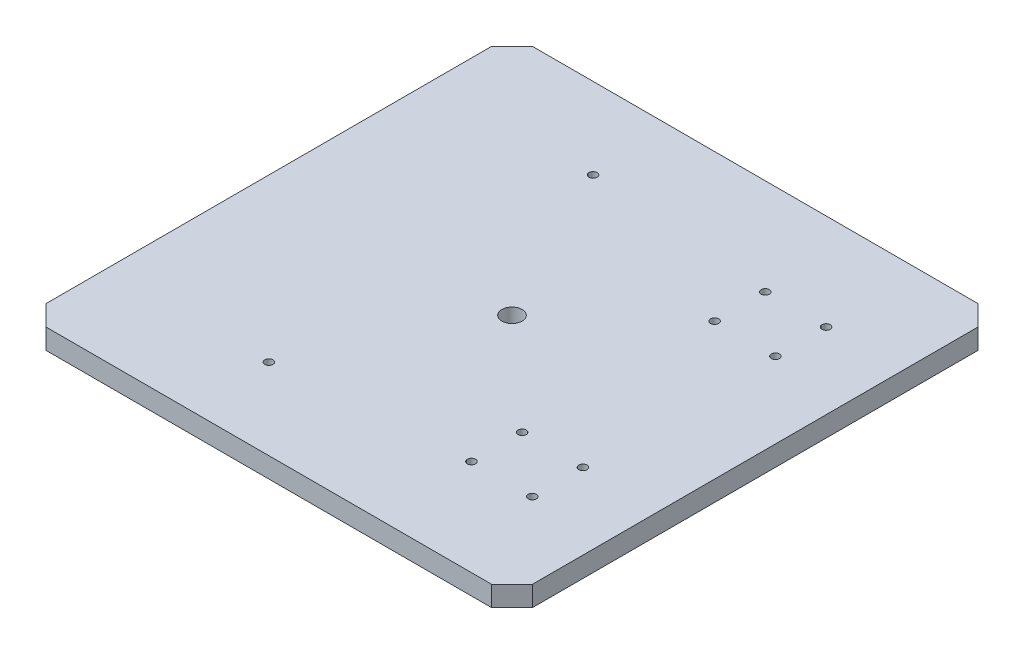
ISO-10303-21;
HEADER;
FILE_DESCRIPTION(('STEP AP214'),'2;1');
FILE_NAME('part.step','',(''),(''),'','','');
FILE_SCHEMA(('AUTOMOTIVE_DESIGN { 1 0 10303 214 1 1 1 1 }'));
ENDSEC;
DATA;
#1=APPLICATION_CONTEXT('core data for automotive mechanical design processes');
#2=APPLICATION_PROTOCOL_DEFINITION('international standard','automotive_design',2000,#1);
#3=PRODUCT_CONTEXT('',#1,'mechanical');
#4=PRODUCT('Part','Part','',(#3));
#5=PRODUCT_RELATED_PRODUCT_CATEGORY('part','',(#4));
#6=PRODUCT_DEFINITION_FORMATION('','',#4);
#7=PRODUCT_DEFINITION_CONTEXT('part definition',#1,'design');
#8=PRODUCT_DEFINITION('design','',#6,#7);
#9=PRODUCT_DEFINITION_SHAPE('','',#8);
#10=(LENGTH_UNIT() NAMED_UNIT(*) SI_UNIT(.MILLI.,.METRE.));
#11=(NAMED_UNIT(*) PLANE_ANGLE_UNIT() SI_UNIT($,.RADIAN.));
#12=(NAMED_UNIT(*) SI_UNIT($,.STERADIAN.) SOLID_ANGLE_UNIT());
#13=UNCERTAINTY_MEASURE_WITH_UNIT(LENGTH_MEASURE(1.E-05),#10,'distance_accuracy_value','');
#14=(GEOMETRIC_REPRESENTATION_CONTEXT(3) GLOBAL_UNCERTAINTY_ASSIGNED_CONTEXT((#13)) GLOBAL_UNIT_ASSIGNED_CONTEXT((#10,
#11,#12)) REPRESENTATION_CONTEXT('',''));
#15=CARTESIAN_POINT('',(0.,0.,0.));
#16=DIRECTION('',(0.,0.,1.));
#17=DIRECTION('',(1.,0.,0.));
#18=AXIS2_PLACEMENT_3D('',#15,#16,#17);
#19=CARTESIAN_POINT('',(0.,0.,0.));
#20=DIRECTION('',(0.,-1.,0.));
#21=DIRECTION('',(0.,0.,-1.));
#22=AXIS2_PLACEMENT_3D('',#19,#20,#21);
#23=PLANE('',#22);
#24=CARTESIAN_POINT('',(257.175,0.,-244.475));
#25=DIRECTION('',(0.,1.,0.));
#26=DIRECTION('',(0.,0.,1.));
#27=AXIS2_PLACEMENT_3D('',#24,#25,#26);
#28=CIRCLE('',#27,2.55270000000002);
#29=CARTESIAN_POINT('',(257.175,0.,-241.9223));
#30=VERTEX_POINT('',#29);
#31=EDGE_CURVE('E237',#30,#30,#28,.T.);
#32=ORIENTED_EDGE('',*,*,#31,.T.);
#33=EDGE_LOOP('',(#32));
#34=FACE_BOUND('',#33,.T.);
#35=CARTESIAN_POINT('',(219.075,0.,-244.475));
#36=DIRECTION('',(0.,1.,0.));
#37=DIRECTION('',(0.,0.,1.));
#38=AXIS2_PLACEMENT_3D('',#35,#36,#37);
#39=CIRCLE('',#38,2.55269999999999);
#40=CARTESIAN_POINT('',(219.075,0.,-241.9223));
#41=VERTEX_POINT('',#40);
#42=EDGE_CURVE('E231',#41,#41,#39,.T.);
#43=ORIENTED_EDGE('',*,*,#42,.T.);
#44=EDGE_LOOP('',(#43));
#45=FACE_BOUND('',#44,.T.);
#46=CARTESIAN_POINT('',(257.175,0.,-212.725));
#47=DIRECTION('',(0.,1.,0.));
#48=DIRECTION('',(0.,0.,1.));
#49=AXIS2_PLACEMENT_3D('',#46,#47,#48);
#50=CIRCLE('',#49,2.55270000000002);
#51=CARTESIAN_POINT('',(257.175,0.,-210.1723));
#52=VERTEX_POINT('',#51);
#53=EDGE_CURVE('E225',#52,#52,#50,.T.);
#54=ORIENTED_EDGE('',*,*,#53,.T.);
#55=EDGE_LOOP('',(#54));
#56=FACE_BOUND('',#55,.T.);
#57=CARTESIAN_POINT('',(219.075,0.,-212.725));
#58=DIRECTION('',(0.,1.,0.));
#59=DIRECTION('',(0.,0.,1.));
#60=AXIS2_PLACEMENT_3D('',#57,#58,#59);
#61=CIRCLE('',#60,2.55269999999999);
#62=CARTESIAN_POINT('',(219.075,0.,-210.1723));
#63=VERTEX_POINT('',#62);
#64=EDGE_CURVE('E219',#63,#63,#61,.T.);
#65=ORIENTED_EDGE('',*,*,#64,.T.);
#66=EDGE_LOOP('',(#65));
#67=FACE_BOUND('',#66,.T.);
#68=CARTESIAN_POINT('',(257.175,0.,-92.0749999999999));
#69=DIRECTION('',(0.,1.,0.));
#70=DIRECTION('',(0.,0.,1.));
#71=AXIS2_PLACEMENT_3D('',#68,#69,#70);
#72=CIRCLE('',#71,2.55270000000002);
#73=CARTESIAN_POINT('',(257.175,0.,-89.5222999999999));
#74=VERTEX_POINT('',#73);
#75=EDGE_CURVE('E213',#74,#74,#72,.T.);
#76=ORIENTED_EDGE('',*,*,#75,.T.);
#77=EDGE_LOOP('',(#76));
#78=FACE_BOUND('',#77,.T.);
#79=DIRECTION('',(1.,0.,0.));
#80=VECTOR('',#79,1.);
#81=CARTESIAN_POINT('',(0.,0.,0.));
#82=LINE('',#81,#80);
#83=CARTESIAN_POINT('',(12.7,0.,0.));
#84=VERTEX_POINT('',#83);
#85=CARTESIAN_POINT('',(292.1,0.,0.));
#86=VERTEX_POINT('',#85);
#87=EDGE_CURVE('E118',#84,#86,#82,.T.);
#88=ORIENTED_EDGE('',*,*,#87,.F.);
#89=DIRECTION('',(0.707106781186546,0.,0.707106781186549));
#90=VECTOR('',#89,1.);
#91=CARTESIAN_POINT('',(6.35000000000002,0.,-6.34999999999999));
#92=LINE('',#91,#90);
#93=CARTESIAN_POINT('',(0.,0.,-12.7));
#94=VERTEX_POINT('',#93);
#95=EDGE_CURVE('E101',#84,#94,#92,.F.);
#96=ORIENTED_EDGE('',*,*,#95,.T.);
#97=DIRECTION('',(0.,0.,1.));
#98=VECTOR('',#97,1.);
#99=CARTESIAN_POINT('',(0.,0.,0.));
#100=LINE('',#99,#98);
#101=CARTESIAN_POINT('',(0.,0.,-292.1));
#102=VERTEX_POINT('',#101);
#103=EDGE_CURVE('E128',#102,#94,#100,.T.);
#104=ORIENTED_EDGE('',*,*,#103,.F.);
#105=DIRECTION('',(-0.707106781186549,0.,0.707106781186546));
#106=VECTOR('',#105,1.);
#107=CARTESIAN_POINT('',(-146.05,0.,-146.050000000001));
#108=LINE('',#107,#106);
#109=CARTESIAN_POINT('',(12.7,0.,-304.8));
#110=VERTEX_POINT('',#109);
#111=EDGE_CURVE('E112',#102,#110,#108,.F.);
#112=ORIENTED_EDGE('',*,*,#111,.T.);
#113=DIRECTION('',(-1.,0.,0.));
#114=VECTOR('',#113,1.);
#115=CARTESIAN_POINT('',(0.,0.,-304.8));
#116=LINE('',#115,#114);
#117=CARTESIAN_POINT('',(292.1,0.,-304.8));
#118=VERTEX_POINT('',#117);
#119=EDGE_CURVE('E131',#118,#110,#116,.T.);
#120=ORIENTED_EDGE('',*,*,#119,.F.);
#121=DIRECTION('',(-0.707106781186546,0.,-0.707106781186549));
#122=VECTOR('',#121,1.);
#123=CARTESIAN_POINT('',(298.450000000001,0.,-298.449999999999));
#124=LINE('',#123,#122);
#125=CARTESIAN_POINT('',(304.8,0.,-292.1));
#126=VERTEX_POINT('',#125);
#127=EDGE_CURVE('E142',#118,#126,#124,.F.);
#128=ORIENTED_EDGE('',*,*,#127,.T.);
#129=DIRECTION('',(0.,0.,-1.));
#130=VECTOR('',#129,1.);
#131=CARTESIAN_POINT('',(304.8,0.,0.));
#132=LINE('',#131,#130);
#133=CARTESIAN_POINT('',(304.8,0.,-12.7));
#134=VERTEX_POINT('',#133);
#135=EDGE_CURVE('E127',#134,#126,#132,.T.);
#136=ORIENTED_EDGE('',*,*,#135,.F.);
#137=DIRECTION('',(0.707106781186549,0.,-0.707106781186546));
#138=VECTOR('',#137,1.);
#139=CARTESIAN_POINT('',(146.049999999999,0.,146.05));
#140=LINE('',#139,#138);
#141=EDGE_CURVE('E122',#134,#86,#140,.F.);
#142=ORIENTED_EDGE('',*,*,#141,.T.);
#143=EDGE_LOOP('',(#88,#96,#104,#112,#120,#128,#136,#142));
#144=FACE_BOUND('',#143,.T.);
#145=CARTESIAN_POINT('',(101.6,0.,-254.));
#146=DIRECTION('',(0.,1.,0.));
#147=DIRECTION('',(0.,0.,1.));
#148=AXIS2_PLACEMENT_3D('',#145,#146,#147);
#149=CIRCLE('',#148,2.55269999999999);
#150=CARTESIAN_POINT('',(101.6,0.,-251.4473));
#151=VERTEX_POINT('',#150);
#152=EDGE_CURVE('E133',#151,#151,#149,.T.);
#153=ORIENTED_EDGE('',*,*,#152,.T.);
#154=EDGE_LOOP('',(#153));
#155=FACE_BOUND('',#154,.T.);
#156=CARTESIAN_POINT('',(101.6,0.,-50.7999999999999));
#157=DIRECTION('',(0.,1.,0.));
#158=DIRECTION('',(0.,0.,1.));
#159=AXIS2_PLACEMENT_3D('',#156,#157,#158);
#160=CIRCLE('',#159,2.55269999999999);
#161=CARTESIAN_POINT('',(101.6,0.,-48.2472999999999));
#162=VERTEX_POINT('',#161);
#163=EDGE_CURVE('E183',#162,#162,#160,.T.);
#164=ORIENTED_EDGE('',*,*,#163,.T.);
#165=EDGE_LOOP('',(#164));
#166=FACE_BOUND('',#165,.T.);
#167=CARTESIAN_POINT('',(152.4,0.,-152.4));
#168=DIRECTION('',(0.,1.,0.));
#169=DIRECTION('',(0.,0.,1.));
#170=AXIS2_PLACEMENT_3D('',#167,#168,#169);
#171=CIRCLE('',#170,6.34999999999999);
#172=CARTESIAN_POINT('',(152.4,0.,-146.05));
#173=VERTEX_POINT('',#172);
#174=EDGE_CURVE('E192',#173,#173,#171,.T.);
#175=ORIENTED_EDGE('',*,*,#174,.T.);
#176=EDGE_LOOP('',(#175));
#177=FACE_BOUND('',#176,.T.);
#178=CARTESIAN_POINT('',(219.075,0.,-60.3249999999999));
#179=DIRECTION('',(0.,1.,0.));
#180=DIRECTION('',(0.,0.,1.));
#181=AXIS2_PLACEMENT_3D('',#178,#179,#180);
#182=CIRCLE('',#181,2.55269999999999);
#183=CARTESIAN_POINT('',(219.075,0.,-57.7722999999999));
#184=VERTEX_POINT('',#183);
#185=EDGE_CURVE('E195',#184,#184,#182,.T.);
#186=ORIENTED_EDGE('',*,*,#185,.T.);
#187=EDGE_LOOP('',(#186));
#188=FACE_BOUND('',#187,.T.);
#189=CARTESIAN_POINT('',(257.175,0.,-60.3249999999999));
#190=DIRECTION('',(0.,1.,0.));
#191=DIRECTION('',(0.,0.,1.));
#192=AXIS2_PLACEMENT_3D('',#189,#190,#191);
#193=CIRCLE('',#192,2.55270000000002);
#194=CARTESIAN_POINT('',(257.175,0.,-57.7722999999999));
#195=VERTEX_POINT('',#194);
#196=EDGE_CURVE('E201',#195,#195,#193,.T.);
#197=ORIENTED_EDGE('',*,*,#196,.T.);
#198=EDGE_LOOP('',(#197));
#199=FACE_BOUND('',#198,.T.);
#200=CARTESIAN_POINT('',(219.075,0.,-92.075));
#201=DIRECTION('',(0.,1.,0.));
#202=DIRECTION('',(0.,0.,1.));
#203=AXIS2_PLACEMENT_3D('',#200,#201,#202);
#204=CIRCLE('',#203,2.55269999999999);
#205=CARTESIAN_POINT('',(219.075,0.,-89.5223));
#206=VERTEX_POINT('',#205);
#207=EDGE_CURVE('E207',#206,#206,#204,.T.);
#208=ORIENTED_EDGE('',*,*,#207,.T.);
#209=EDGE_LOOP('',(#208));
#210=FACE_BOUND('',#209,.T.);
#211=ADVANCED_FACE('F35',(#34,#45,#56,#67,#78,#144,#155,#166,#177,#188,#199,#210),#23,.T.);
#212=CARTESIAN_POINT('',(0.,12.7,0.));
#213=DIRECTION('',(1.,0.,0.));
#214=DIRECTION('',(0.,0.,-1.));
#215=AXIS2_PLACEMENT_3D('',#212,#213,#214);
#216=PLANE('',#215);
#217=ORIENTED_EDGE('',*,*,#103,.T.);
#218=DIRECTION('',(0.,1.,0.));
#219=VECTOR('',#218,1.);
#220=CARTESIAN_POINT('',(0.,12.7,-12.7));
#221=LINE('',#220,#219);
#222=CARTESIAN_POINT('',(0.,12.7,-12.7));
#223=VERTEX_POINT('',#222);
#224=EDGE_CURVE('E106',#94,#223,#221,.T.);
#225=ORIENTED_EDGE('',*,*,#224,.T.);
#226=DIRECTION('',(0.,0.,1.));
#227=VECTOR('',#226,1.);
#228=CARTESIAN_POINT('',(0.,12.7,0.));
#229=LINE('',#228,#227);
#230=CARTESIAN_POINT('',(0.,12.7,-292.1));
#231=VERTEX_POINT('',#230);
#232=EDGE_CURVE('E138',#231,#223,#229,.T.);
#233=ORIENTED_EDGE('',*,*,#232,.F.);
#234=DIRECTION('',(0.,-1.,0.));
#235=VECTOR('',#234,1.);
#236=CARTESIAN_POINT('',(0.,12.7,-292.1));
#237=LINE('',#236,#235);
#238=EDGE_CURVE('E111',#231,#102,#237,.T.);
#239=ORIENTED_EDGE('',*,*,#238,.T.);
#240=EDGE_LOOP('',(#217,#225,#233,#239));
#241=FACE_BOUND('',#240,.T.);
#242=ADVANCED_FACE('F272',(#241),#216,.F.);
#243=CARTESIAN_POINT('',(0.,12.7,0.));
#244=DIRECTION('',(0.,0.,-1.));
#245=DIRECTION('',(-1.,0.,0.));
#246=AXIS2_PLACEMENT_3D('',#243,#244,#245);
#247=PLANE('',#246);
#248=DIRECTION('',(1.,0.,0.));
#249=VECTOR('',#248,1.);
#250=CARTESIAN_POINT('',(0.,12.7,0.));
#251=LINE('',#250,#249);
#252=CARTESIAN_POINT('',(12.7,12.7,0.));
#253=VERTEX_POINT('',#252);
#254=CARTESIAN_POINT('',(292.1,12.7,0.));
#255=VERTEX_POINT('',#254);
#256=EDGE_CURVE('E121',#253,#255,#251,.T.);
#257=ORIENTED_EDGE('',*,*,#256,.F.);
#258=DIRECTION('',(0.,-1.,0.));
#259=VECTOR('',#258,1.);
#260=CARTESIAN_POINT('',(12.7,12.7,0.));
#261=LINE('',#260,#259);
#262=EDGE_CURVE('E105',#253,#84,#261,.T.);
#263=ORIENTED_EDGE('',*,*,#262,.T.);
#264=ORIENTED_EDGE('',*,*,#87,.T.);
#265=DIRECTION('',(0.,1.,0.));
#266=VECTOR('',#265,1.);
#267=CARTESIAN_POINT('',(292.1,12.7,0.));
#268=LINE('',#267,#266);
#269=EDGE_CURVE('E123',#86,#255,#268,.T.);
#270=ORIENTED_EDGE('',*,*,#269,.T.);
#271=EDGE_LOOP('',(#257,#263,#264,#270));
#272=FACE_BOUND('',#271,.T.);
#273=ADVANCED_FACE('F117',(#272),#247,.F.);
#274=CARTESIAN_POINT('',(304.8,12.7,0.));
#275=DIRECTION('',(-1.,0.,0.));
#276=DIRECTION('',(0.,0.,1.));
#277=AXIS2_PLACEMENT_3D('',#274,#275,#276);
#278=PLANE('',#277);
#279=ORIENTED_EDGE('',*,*,#135,.T.);
#280=DIRECTION('',(0.,1.,0.));
#281=VECTOR('',#280,1.);
#282=CARTESIAN_POINT('',(304.8,12.7,-292.1));
#283=LINE('',#282,#281);
#284=CARTESIAN_POINT('',(304.8,12.7,-292.1));
#285=VERTEX_POINT('',#284);
#286=EDGE_CURVE('E11',#126,#285,#283,.T.);
#287=ORIENTED_EDGE('',*,*,#286,.T.);
#288=DIRECTION('',(0.,0.,-1.));
#289=VECTOR('',#288,1.);
#290=CARTESIAN_POINT('',(304.8,12.7,0.));
#291=LINE('',#290,#289);
#292=CARTESIAN_POINT('',(304.8,12.7,-12.7));
#293=VERTEX_POINT('',#292);
#294=EDGE_CURVE('E164',#293,#285,#291,.T.);
#295=ORIENTED_EDGE('',*,*,#294,.F.);
#296=DIRECTION('',(0.,-1.,0.));
#297=VECTOR('',#296,1.);
#298=CARTESIAN_POINT('',(304.8,12.7,-12.7));
#299=LINE('',#298,#297);
#300=EDGE_CURVE('E43',#293,#134,#299,.T.);
#301=ORIENTED_EDGE('',*,*,#300,.T.);
#302=EDGE_LOOP('',(#279,#287,#295,#301));
#303=FACE_BOUND('',#302,.T.);
#304=ADVANCED_FACE('F162',(#303),#278,.F.);
#305=CARTESIAN_POINT('',(0.,12.7,-304.8));
#306=DIRECTION('',(0.,0.,1.));
#307=DIRECTION('',(1.,0.,0.));
#308=AXIS2_PLACEMENT_3D('',#305,#306,#307);
#309=PLANE('',#308);
#310=ORIENTED_EDGE('',*,*,#119,.T.);
#311=DIRECTION('',(0.,1.,0.));
#312=VECTOR('',#311,1.);
#313=CARTESIAN_POINT('',(12.7,12.7,-304.8));
#314=LINE('',#313,#312);
#315=CARTESIAN_POINT('',(12.7,12.7,-304.8));
#316=VERTEX_POINT('',#315);
#317=EDGE_CURVE('E50',#110,#316,#314,.T.);
#318=ORIENTED_EDGE('',*,*,#317,.T.);
#319=DIRECTION('',(-1.,0.,0.));
#320=VECTOR('',#319,1.);
#321=CARTESIAN_POINT('',(0.,12.7,-304.8));
#322=LINE('',#321,#320);
#323=CARTESIAN_POINT('',(292.1,12.7,-304.8));
#324=VERTEX_POINT('',#323);
#325=EDGE_CURVE('E139',#324,#316,#322,.T.);
#326=ORIENTED_EDGE('',*,*,#325,.F.);
#327=DIRECTION('',(0.,-1.,0.));
#328=VECTOR('',#327,1.);
#329=CARTESIAN_POINT('',(292.1,12.7,-304.8));
#330=LINE('',#329,#328);
#331=EDGE_CURVE('E155',#324,#118,#330,.T.);
#332=ORIENTED_EDGE('',*,*,#331,.T.);
#333=EDGE_LOOP('',(#310,#318,#326,#332));
#334=FACE_BOUND('',#333,.T.);
#335=ADVANCED_FACE('F171',(#334),#309,.F.);
#336=CARTESIAN_POINT('',(0.,12.7,0.));
#337=DIRECTION('',(0.,-1.,0.));
#338=DIRECTION('',(0.,0.,-1.));
#339=AXIS2_PLACEMENT_3D('',#336,#337,#338);
#340=PLANE('',#339);
#341=CARTESIAN_POINT('',(257.175,12.7,-244.475));
#342=DIRECTION('',(0.,1.,0.));
#343=DIRECTION('',(0.,0.,1.));
#344=AXIS2_PLACEMENT_3D('',#341,#342,#343);
#345=CIRCLE('',#344,2.55269999999996);
#346=CARTESIAN_POINT('',(257.175,12.7,-241.9223));
#347=VERTEX_POINT('',#346);
#348=EDGE_CURVE('E240',#347,#347,#345,.T.);
#349=ORIENTED_EDGE('',*,*,#348,.F.);
#350=EDGE_LOOP('',(#349));
#351=FACE_BOUND('',#350,.T.);
#352=CARTESIAN_POINT('',(219.075,12.7,-244.475));
#353=DIRECTION('',(0.,1.,0.));
#354=DIRECTION('',(0.,0.,1.));
#355=AXIS2_PLACEMENT_3D('',#352,#353,#354);
#356=CIRCLE('',#355,2.55269999999999);
#357=CARTESIAN_POINT('',(219.075,12.7,-241.9223));
#358=VERTEX_POINT('',#357);
#359=EDGE_CURVE('E234',#358,#358,#356,.T.);
#360=ORIENTED_EDGE('',*,*,#359,.F.);
#361=EDGE_LOOP('',(#360));
#362=FACE_BOUND('',#361,.T.);
#363=CARTESIAN_POINT('',(257.175,12.7,-212.725));
#364=DIRECTION('',(0.,1.,0.));
#365=DIRECTION('',(0.,0.,1.));
#366=AXIS2_PLACEMENT_3D('',#363,#364,#365);
#367=CIRCLE('',#366,2.55269999999996);
#368=CARTESIAN_POINT('',(257.175,12.7,-210.1723));
#369=VERTEX_POINT('',#368);
#370=EDGE_CURVE('E228',#369,#369,#367,.T.);
#371=ORIENTED_EDGE('',*,*,#370,.F.);
#372=EDGE_LOOP('',(#371));
#373=FACE_BOUND('',#372,.T.);
#374=CARTESIAN_POINT('',(219.075,12.7,-212.725));
#375=DIRECTION('',(0.,1.,0.));
#376=DIRECTION('',(0.,0.,1.));
#377=AXIS2_PLACEMENT_3D('',#374,#375,#376);
#378=CIRCLE('',#377,2.55269999999999);
#379=CARTESIAN_POINT('',(219.075,12.7,-210.1723));
#380=VERTEX_POINT('',#379);
#381=EDGE_CURVE('E222',#380,#380,#378,.T.);
#382=ORIENTED_EDGE('',*,*,#381,.F.);
#383=EDGE_LOOP('',(#382));
#384=FACE_BOUND('',#383,.T.);
#385=CARTESIAN_POINT('',(257.175,12.7,-92.0749999999999));
#386=DIRECTION('',(0.,1.,0.));
#387=DIRECTION('',(0.,0.,1.));
#388=AXIS2_PLACEMENT_3D('',#385,#386,#387);
#389=CIRCLE('',#388,2.55269999999996);
#390=CARTESIAN_POINT('',(257.175,12.7,-89.5222999999999));
#391=VERTEX_POINT('',#390);
#392=EDGE_CURVE('E216',#391,#391,#389,.T.);
#393=ORIENTED_EDGE('',*,*,#392,.F.);
#394=EDGE_LOOP('',(#393));
#395=FACE_BOUND('',#394,.T.);
#396=CARTESIAN_POINT('',(219.075,12.7,-92.075));
#397=DIRECTION('',(0.,1.,0.));
#398=DIRECTION('',(0.,0.,1.));
#399=AXIS2_PLACEMENT_3D('',#396,#397,#398);
#400=CIRCLE('',#399,2.55269999999999);
#401=CARTESIAN_POINT('',(219.075,12.7,-89.5223));
#402=VERTEX_POINT('',#401);
#403=EDGE_CURVE('E210',#402,#402,#400,.T.);
#404=ORIENTED_EDGE('',*,*,#403,.F.);
#405=EDGE_LOOP('',(#404));
#406=FACE_BOUND('',#405,.T.);
#407=CARTESIAN_POINT('',(257.175,12.7,-60.3249999999999));
#408=DIRECTION('',(0.,1.,0.));
#409=DIRECTION('',(0.,0.,1.));
#410=AXIS2_PLACEMENT_3D('',#407,#408,#409);
#411=CIRCLE('',#410,2.55269999999996);
#412=CARTESIAN_POINT('',(257.175,12.7,-57.7722999999999));
#413=VERTEX_POINT('',#412);
#414=EDGE_CURVE('E204',#413,#413,#411,.T.);
#415=ORIENTED_EDGE('',*,*,#414,.F.);
#416=EDGE_LOOP('',(#415));
#417=FACE_BOUND('',#416,.T.);
#418=CARTESIAN_POINT('',(219.075,12.7,-60.3249999999999));
#419=DIRECTION('',(0.,1.,0.));
#420=DIRECTION('',(0.,0.,1.));
#421=AXIS2_PLACEMENT_3D('',#418,#419,#420);
#422=CIRCLE('',#421,2.55269999999999);
#423=CARTESIAN_POINT('',(219.075,12.7,-57.7722999999999));
#424=VERTEX_POINT('',#423);
#425=EDGE_CURVE('E198',#424,#424,#422,.T.);
#426=ORIENTED_EDGE('',*,*,#425,.F.);
#427=EDGE_LOOP('',(#426));
#428=FACE_BOUND('',#427,.T.);
#429=CARTESIAN_POINT('',(152.4,12.7,-152.4));
#430=DIRECTION('',(0.,-1.,0.));
#431=DIRECTION('',(0.,0.,-1.));
#432=AXIS2_PLACEMENT_3D('',#429,#430,#431);
#433=CIRCLE('',#432,6.34999999999999);
#434=CARTESIAN_POINT('',(152.4,12.7,-158.75));
#435=VERTEX_POINT('',#434);
#436=EDGE_CURVE('E189',#435,#435,#433,.T.);
#437=ORIENTED_EDGE('',*,*,#436,.T.);
#438=EDGE_LOOP('',(#437));
#439=FACE_BOUND('',#438,.T.);
#440=CARTESIAN_POINT('',(101.6,12.7,-50.7999999999999));
#441=DIRECTION('',(0.,1.,0.));
#442=DIRECTION('',(0.,0.,1.));
#443=AXIS2_PLACEMENT_3D('',#440,#441,#442);
#444=CIRCLE('',#443,2.55269999999999);
#445=CARTESIAN_POINT('',(101.6,12.7,-48.2472999999999));
#446=VERTEX_POINT('',#445);
#447=EDGE_CURVE('E186',#446,#446,#444,.T.);
#448=ORIENTED_EDGE('',*,*,#447,.F.);
#449=EDGE_LOOP('',(#448));
#450=FACE_BOUND('',#449,.T.);
#451=CARTESIAN_POINT('',(101.6,12.7,-254.));
#452=DIRECTION('',(0.,1.,0.));
#453=DIRECTION('',(0.,0.,1.));
#454=AXIS2_PLACEMENT_3D('',#451,#452,#453);
#455=CIRCLE('',#454,2.55269999999999);
#456=CARTESIAN_POINT('',(101.6,12.7,-251.4473));
#457=VERTEX_POINT('',#456);
#458=EDGE_CURVE('E180',#457,#457,#455,.T.);
#459=ORIENTED_EDGE('',*,*,#458,.F.);
#460=EDGE_LOOP('',(#459));
#461=FACE_BOUND('',#460,.T.);
#462=ORIENTED_EDGE('',*,*,#232,.T.);
#463=DIRECTION('',(-0.707106781186546,0.,-0.707106781186549));
#464=VECTOR('',#463,1.);
#465=CARTESIAN_POINT('',(12.7,12.7,0.));
#466=LINE('',#465,#464);
#467=EDGE_CURVE('E153',#223,#253,#466,.F.);
#468=ORIENTED_EDGE('',*,*,#467,.T.);
#469=ORIENTED_EDGE('',*,*,#256,.T.);
#470=DIRECTION('',(-0.707106781186549,0.,0.707106781186546));
#471=VECTOR('',#470,1.);
#472=CARTESIAN_POINT('',(304.8,12.7,-12.7));
#473=LINE('',#472,#471);
#474=EDGE_CURVE('E148',#255,#293,#473,.F.);
#475=ORIENTED_EDGE('',*,*,#474,.T.);
#476=ORIENTED_EDGE('',*,*,#294,.T.);
#477=DIRECTION('',(0.707106781186546,0.,0.707106781186549));
#478=VECTOR('',#477,1.);
#479=CARTESIAN_POINT('',(292.1,12.7,-304.8));
#480=LINE('',#479,#478);
#481=EDGE_CURVE('E57',#285,#324,#480,.F.);
#482=ORIENTED_EDGE('',*,*,#481,.T.);
#483=ORIENTED_EDGE('',*,*,#325,.T.);
#484=DIRECTION('',(0.707106781186549,0.,-0.707106781186546));
#485=VECTOR('',#484,1.);
#486=CARTESIAN_POINT('',(0.,12.7,-292.1));
#487=LINE('',#486,#485);
#488=EDGE_CURVE('E151',#316,#231,#487,.F.);
#489=ORIENTED_EDGE('',*,*,#488,.T.);
#490=EDGE_LOOP('',(#462,#468,#469,#475,#476,#482,#483,#489));
#491=FACE_BOUND('',#490,.T.);
#492=ADVANCED_FACE('F246',(#351,#362,#373,#384,#395,#406,#417,#428,#439,#450,#461,#491),#340,.F.);
#493=CARTESIAN_POINT('',(12.7,12.7,0.));
#494=DIRECTION('',(0.707106781186549,0.,-0.707106781186546));
#495=DIRECTION('',(0.,-1.,0.));
#496=AXIS2_PLACEMENT_3D('',#493,#494,#495);
#497=PLANE('',#496);
#498=ORIENTED_EDGE('',*,*,#467,.F.);
#499=ORIENTED_EDGE('',*,*,#224,.F.);
#500=ORIENTED_EDGE('',*,*,#95,.F.);
#501=ORIENTED_EDGE('',*,*,#262,.F.);
#502=EDGE_LOOP('',(#498,#499,#500,#501));
#503=FACE_BOUND('',#502,.T.);
#504=ADVANCED_FACE('F104',(#503),#497,.F.);
#505=CARTESIAN_POINT('',(0.,12.7,-292.1));
#506=DIRECTION('',(0.707106781186546,0.,0.707106781186549));
#507=DIRECTION('',(0.,-1.,0.));
#508=AXIS2_PLACEMENT_3D('',#505,#506,#507);
#509=PLANE('',#508);
#510=ORIENTED_EDGE('',*,*,#488,.F.);
#511=ORIENTED_EDGE('',*,*,#317,.F.);
#512=ORIENTED_EDGE('',*,*,#111,.F.);
#513=ORIENTED_EDGE('',*,*,#238,.F.);
#514=EDGE_LOOP('',(#510,#511,#512,#513));
#515=FACE_BOUND('',#514,.T.);
#516=ADVANCED_FACE('F274',(#515),#509,.F.);
#517=CARTESIAN_POINT('',(292.1,12.7,-304.8));
#518=DIRECTION('',(-0.707106781186549,0.,0.707106781186546));
#519=DIRECTION('',(0.,-1.,0.));
#520=AXIS2_PLACEMENT_3D('',#517,#518,#519);
#521=PLANE('',#520);
#522=ORIENTED_EDGE('',*,*,#481,.F.);
#523=ORIENTED_EDGE('',*,*,#286,.F.);
#524=ORIENTED_EDGE('',*,*,#127,.F.);
#525=ORIENTED_EDGE('',*,*,#331,.F.);
#526=EDGE_LOOP('',(#522,#523,#524,#525));
#527=FACE_BOUND('',#526,.T.);
#528=ADVANCED_FACE('F170',(#527),#521,.F.);
#529=CARTESIAN_POINT('',(304.8,12.7,-12.7));
#530=DIRECTION('',(-0.707106781186546,0.,-0.707106781186549));
#531=DIRECTION('',(0.,-1.,0.));
#532=AXIS2_PLACEMENT_3D('',#529,#530,#531);
#533=PLANE('',#532);
#534=ORIENTED_EDGE('',*,*,#474,.F.);
#535=ORIENTED_EDGE('',*,*,#269,.F.);
#536=ORIENTED_EDGE('',*,*,#141,.F.);
#537=ORIENTED_EDGE('',*,*,#300,.F.);
#538=EDGE_LOOP('',(#534,#535,#536,#537));
#539=FACE_BOUND('',#538,.T.);
#540=ADVANCED_FACE('F37',(#539),#533,.F.);
#541=CARTESIAN_POINT('',(101.6,12.7,-254.));
#542=DIRECTION('',(0.,1.,0.));
#543=DIRECTION('',(0.,0.,1.));
#544=AXIS2_PLACEMENT_3D('',#541,#542,#543);
#545=CYLINDRICAL_SURFACE('',#544,2.55269999999999);
#546=ORIENTED_EDGE('',*,*,#152,.F.);
#547=EDGE_LOOP('',(#546));
#548=FACE_BOUND('',#547,.T.);
#549=ORIENTED_EDGE('',*,*,#458,.T.);
#550=EDGE_LOOP('',(#549));
#551=FACE_BOUND('',#550,.T.);
#552=ADVANCED_FACE('F340',(#548,#551),#545,.F.);
#553=CARTESIAN_POINT('',(101.6,12.7,-50.7999999999999));
#554=DIRECTION('',(0.,1.,0.));
#555=DIRECTION('',(0.,0.,1.));
#556=AXIS2_PLACEMENT_3D('',#553,#554,#555);
#557=CYLINDRICAL_SURFACE('',#556,2.55269999999999);
#558=ORIENTED_EDGE('',*,*,#163,.F.);
#559=EDGE_LOOP('',(#558));
#560=FACE_BOUND('',#559,.T.);
#561=ORIENTED_EDGE('',*,*,#447,.T.);
#562=EDGE_LOOP('',(#561));
#563=FACE_BOUND('',#562,.T.);
#564=ADVANCED_FACE('F349',(#560,#563),#557,.F.);
#565=CARTESIAN_POINT('',(152.4,0.,-152.4));
#566=DIRECTION('',(0.,1.,0.));
#567=DIRECTION('',(0.,0.,1.));
#568=AXIS2_PLACEMENT_3D('',#565,#566,#567);
#569=CYLINDRICAL_SURFACE('',#568,6.34999999999999);
#570=ORIENTED_EDGE('',*,*,#174,.F.);
#571=EDGE_LOOP('',(#570));
#572=FACE_BOUND('',#571,.T.);
#573=ORIENTED_EDGE('',*,*,#436,.F.);
#574=EDGE_LOOP('',(#573));
#575=FACE_BOUND('',#574,.T.);
#576=ADVANCED_FACE('F359',(#572,#575),#569,.F.);
#577=CARTESIAN_POINT('',(219.075,12.7,-60.3249999999999));
#578=DIRECTION('',(0.,1.,0.));
#579=DIRECTION('',(0.,0.,1.));
#580=AXIS2_PLACEMENT_3D('',#577,#578,#579);
#581=CYLINDRICAL_SURFACE('',#580,2.55269999999999);
#582=ORIENTED_EDGE('',*,*,#185,.F.);
#583=EDGE_LOOP('',(#582));
#584=FACE_BOUND('',#583,.T.);
#585=ORIENTED_EDGE('',*,*,#425,.T.);
#586=EDGE_LOOP('',(#585));
#587=FACE_BOUND('',#586,.T.);
#588=ADVANCED_FACE('F368',(#584,#587),#581,.F.);
#589=CARTESIAN_POINT('',(257.175,12.7,-60.3249999999999));
#590=DIRECTION('',(0.,1.,0.));
#591=DIRECTION('',(0.,0.,1.));
#592=AXIS2_PLACEMENT_3D('',#589,#590,#591);
#593=CYLINDRICAL_SURFACE('',#592,2.55269999999999);
#594=ORIENTED_EDGE('',*,*,#196,.F.);
#595=EDGE_LOOP('',(#594));
#596=FACE_BOUND('',#595,.T.);
#597=ORIENTED_EDGE('',*,*,#414,.T.);
#598=EDGE_LOOP('',(#597));
#599=FACE_BOUND('',#598,.T.);
#600=ADVANCED_FACE('F384',(#596,#599),#593,.F.);
#601=CARTESIAN_POINT('',(219.075,12.7,-92.075));
#602=DIRECTION('',(0.,1.,0.));
#603=DIRECTION('',(0.,0.,1.));
#604=AXIS2_PLACEMENT_3D('',#601,#602,#603);
#605=CYLINDRICAL_SURFACE('',#604,2.55269999999999);
#606=ORIENTED_EDGE('',*,*,#207,.F.);
#607=EDGE_LOOP('',(#606));
#608=FACE_BOUND('',#607,.T.);
#609=ORIENTED_EDGE('',*,*,#403,.T.);
#610=EDGE_LOOP('',(#609));
#611=FACE_BOUND('',#610,.T.);
#612=ADVANCED_FACE('F392',(#608,#611),#605,.F.);
#613=CARTESIAN_POINT('',(257.175,12.7,-92.0749999999999));
#614=DIRECTION('',(0.,1.,0.));
#615=DIRECTION('',(0.,0.,1.));
#616=AXIS2_PLACEMENT_3D('',#613,#614,#615);
#617=CYLINDRICAL_SURFACE('',#616,2.55269999999999);
#618=ORIENTED_EDGE('',*,*,#75,.F.);
#619=EDGE_LOOP('',(#618));
#620=FACE_BOUND('',#619,.T.);
#621=ORIENTED_EDGE('',*,*,#392,.T.);
#622=EDGE_LOOP('',(#621));
#623=FACE_BOUND('',#622,.T.);
#624=ADVANCED_FACE('F400',(#620,#623),#617,.F.);
#625=CARTESIAN_POINT('',(219.075,12.7,-212.725));
#626=DIRECTION('',(0.,1.,0.));
#627=DIRECTION('',(0.,0.,1.));
#628=AXIS2_PLACEMENT_3D('',#625,#626,#627);
#629=CYLINDRICAL_SURFACE('',#628,2.55269999999999);
#630=ORIENTED_EDGE('',*,*,#64,.F.);
#631=EDGE_LOOP('',(#630));
#632=FACE_BOUND('',#631,.T.);
#633=ORIENTED_EDGE('',*,*,#381,.T.);
#634=EDGE_LOOP('',(#633));
#635=FACE_BOUND('',#634,.T.);
#636=ADVANCED_FACE('F407',(#632,#635),#629,.F.);
#637=CARTESIAN_POINT('',(257.175,12.7,-212.725));
#638=DIRECTION('',(0.,1.,0.));
#639=DIRECTION('',(0.,0.,1.));
#640=AXIS2_PLACEMENT_3D('',#637,#638,#639);
#641=CYLINDRICAL_SURFACE('',#640,2.55269999999999);
#642=ORIENTED_EDGE('',*,*,#53,.F.);
#643=EDGE_LOOP('',(#642));
#644=FACE_BOUND('',#643,.T.);
#645=ORIENTED_EDGE('',*,*,#370,.T.);
#646=EDGE_LOOP('',(#645));
#647=FACE_BOUND('',#646,.T.);
#648=ADVANCED_FACE('F415',(#644,#647),#641,.F.);
#649=CARTESIAN_POINT('',(219.075,12.7,-244.475));
#650=DIRECTION('',(0.,1.,0.));
#651=DIRECTION('',(0.,0.,1.));
#652=AXIS2_PLACEMENT_3D('',#649,#650,#651);
#653=CYLINDRICAL_SURFACE('',#652,2.55269999999999);
#654=ORIENTED_EDGE('',*,*,#42,.F.);
#655=EDGE_LOOP('',(#654));
#656=FACE_BOUND('',#655,.T.);
#657=ORIENTED_EDGE('',*,*,#359,.T.);
#658=EDGE_LOOP('',(#657));
#659=FACE_BOUND('',#658,.T.);
#660=ADVANCED_FACE('F423',(#656,#659),#653,.F.);
#661=CARTESIAN_POINT('',(257.175,12.7,-244.475));
#662=DIRECTION('',(0.,1.,0.));
#663=DIRECTION('',(0.,0.,1.));
#664=AXIS2_PLACEMENT_3D('',#661,#662,#663);
#665=CYLINDRICAL_SURFACE('',#664,2.55269999999999);
#666=ORIENTED_EDGE('',*,*,#31,.F.);
#667=EDGE_LOOP('',(#666));
#668=FACE_BOUND('',#667,.T.);
#669=ORIENTED_EDGE('',*,*,#348,.T.);
#670=EDGE_LOOP('',(#669));
#671=FACE_BOUND('',#670,.T.);
#672=ADVANCED_FACE('F244',(#668,#671),#665,.F.);
#673=CLOSED_SHELL('',(#211,#242,#273,#304,#335,#492,#504,#516,#528,#540,#552,#564,#576,#588,
#600,#612,#624,#636,#648,#660,#672));
#674=MANIFOLD_SOLID_BREP('B2',#673);
#675=ADVANCED_BREP_SHAPE_REPRESENTATION('',(#18,#674),#14);
#676=SHAPE_DEFINITION_REPRESENTATION(#9,#675);
ENDSEC;
END-ISO-10303-21;
